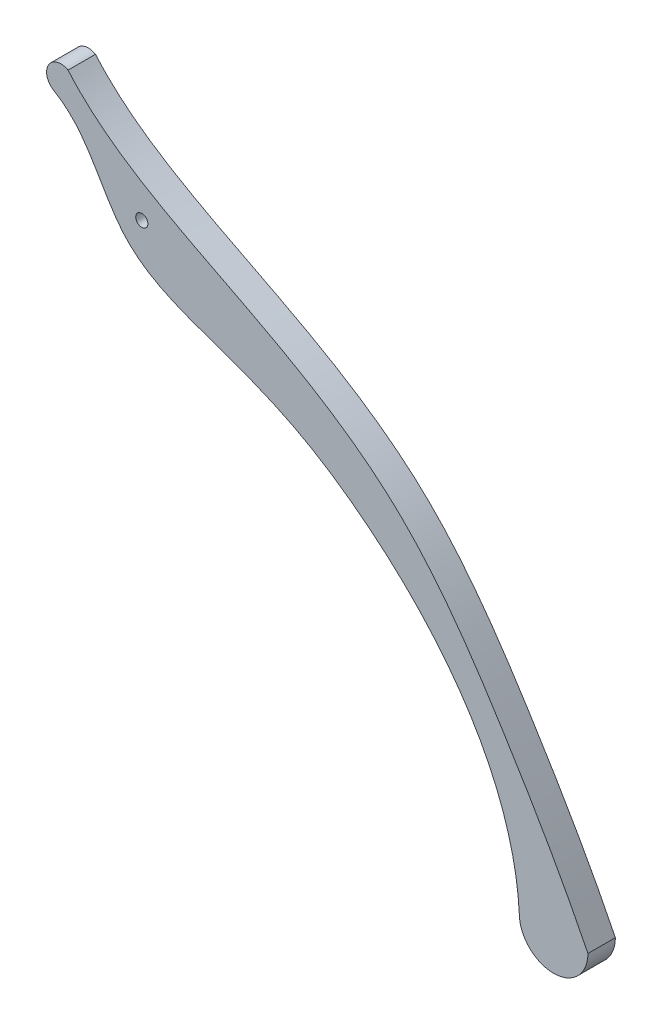
ISO-10303-21;
HEADER;
FILE_DESCRIPTION(('STEP AP214'),'2;1');
FILE_NAME('part.step','',(''),(''),'','','');
FILE_SCHEMA(('AUTOMOTIVE_DESIGN { 1 0 10303 214 1 1 1 1 }'));
ENDSEC;
DATA;
#1=APPLICATION_CONTEXT('core data for automotive mechanical design processes');
#2=APPLICATION_PROTOCOL_DEFINITION('international standard','automotive_design',2000,#1);
#3=PRODUCT_CONTEXT('',#1,'mechanical');
#4=PRODUCT('Part','Part','',(#3));
#5=PRODUCT_RELATED_PRODUCT_CATEGORY('part','',(#4));
#6=PRODUCT_DEFINITION_FORMATION('','',#4);
#7=PRODUCT_DEFINITION_CONTEXT('part definition',#1,'design');
#8=PRODUCT_DEFINITION('design','',#6,#7);
#9=PRODUCT_DEFINITION_SHAPE('','',#8);
#10=(LENGTH_UNIT() NAMED_UNIT(*) SI_UNIT(.MILLI.,.METRE.));
#11=(NAMED_UNIT(*) PLANE_ANGLE_UNIT() SI_UNIT($,.RADIAN.));
#12=(NAMED_UNIT(*) SI_UNIT($,.STERADIAN.) SOLID_ANGLE_UNIT());
#13=UNCERTAINTY_MEASURE_WITH_UNIT(LENGTH_MEASURE(1.E-05),#10,'distance_accuracy_value','');
#14=(GEOMETRIC_REPRESENTATION_CONTEXT(3) GLOBAL_UNCERTAINTY_ASSIGNED_CONTEXT((#13)) GLOBAL_UNIT_ASSIGNED_CONTEXT((#10,
#11,#12)) REPRESENTATION_CONTEXT('',''));
#15=CARTESIAN_POINT('',(0.,0.,0.));
#16=DIRECTION('',(0.,0.,1.));
#17=DIRECTION('',(1.,0.,0.));
#18=AXIS2_PLACEMENT_3D('',#15,#16,#17);
#19=CARTESIAN_POINT('',(103.749844585702,-46.7797880173356,12.));
#20=DIRECTION('',(0.,0.,-1.));
#21=DIRECTION('',(-1.,0.,0.));
#22=AXIS2_PLACEMENT_3D('',#19,#20,#21);
#23=PLANE('',#22);
#24=CARTESIAN_POINT('',(195.000000000002,-180.,12.));
#25=CARTESIAN_POINT('',(183.811606986597,-157.342321494581,12.));
#26=CARTESIAN_POINT('',(158.250235065065,-113.410127760625,12.));
#27=CARTESIAN_POINT('',(116.000678333989,-50.5499551036178,12.));
#28=CARTESIAN_POINT('',(57.9076464876068,-15.3354422556465,12.));
#29=CARTESIAN_POINT('',(6.81742219202341,8.98562715686081,12.));
#30=CARTESIAN_POINT('',(-21.4870672438359,28.2857555584715,12.));
#31=CARTESIAN_POINT('',(-32.2303390593276,40.7679978329799,12.));
#32=B_SPLINE_CURVE_WITH_KNOTS('',3,(#24,#25,#26,#27,#28,#29,#30,#31),.UNSPECIFIED.,.F.,.F.,(4,1,
1,1,1,4),(0.,0.232080309990944,0.474775462913226,0.686323669648783,0.849135819021429,1.),.UNSPECIFIED.);
#33=CARTESIAN_POINT('',(195.000000000002,-180.,12.));
#34=VERTEX_POINT('',#33);
#35=CARTESIAN_POINT('',(-32.2303390593276,40.7679978329799,12.));
#36=VERTEX_POINT('',#35);
#37=EDGE_CURVE('E92',#34,#36,#32,.T.);
#38=ORIENTED_EDGE('',*,*,#37,.T.);
#39=CARTESIAN_POINT('',(-35.3553390593276,35.3553390593272,12.));
#40=DIRECTION('',(0.,0.,1.));
#41=DIRECTION('',(1.,0.,0.));
#42=AXIS2_PLACEMENT_3D('',#39,#40,#41);
#43=CIRCLE('',#42,6.25);
#44=CARTESIAN_POINT('',(-38.4803390593276,29.9426802856744,12.));
#45=VERTEX_POINT('',#44);
#46=EDGE_CURVE('E87',#36,#45,#43,.T.);
#47=ORIENTED_EDGE('',*,*,#46,.T.);
#48=CARTESIAN_POINT('',(-38.4803390593276,29.9426802856744,12.));
#49=CARTESIAN_POINT('',(-22.680791600564,20.9370981787638,12.));
#50=CARTESIAN_POINT('',(-13.7884141041697,-16.124755263341,12.));
#51=CARTESIAN_POINT('',(31.9147437360242,-30.151499794935,12.));
#52=CARTESIAN_POINT('',(67.2533980560327,-43.969392633581,12.));
#53=CARTESIAN_POINT('',(125.0616388722,-82.2156870589665,12.));
#54=CARTESIAN_POINT('',(162.607495356262,-132.950915283272,12.));
#55=CARTESIAN_POINT('',(165.000000000002,-180.,12.));
#56=B_SPLINE_CURVE_WITH_KNOTS('',3,(#48,#49,#50,#51,#52,#53,#54,#55),.UNSPECIFIED.,.F.,.F.,(4,1,
1,1,1,4),(0.,0.170787223157725,0.322785997695807,0.434260945483005,0.547848928197921,1.),.UNSPECIFIED.);
#57=CARTESIAN_POINT('',(165.000000000002,-180.,12.));
#58=VERTEX_POINT('',#57);
#59=EDGE_CURVE('E90',#45,#58,#56,.T.);
#60=ORIENTED_EDGE('',*,*,#59,.T.);
#61=CARTESIAN_POINT('',(180.000000000002,-180.,12.));
#62=DIRECTION('',(0.,0.,1.));
#63=DIRECTION('',(1.,0.,0.));
#64=AXIS2_PLACEMENT_3D('',#61,#62,#63);
#65=CIRCLE('',#64,15.);
#66=EDGE_CURVE('E57',#58,#34,#65,.T.);
#67=ORIENTED_EDGE('',*,*,#66,.T.);
#68=EDGE_LOOP('',(#38,#47,#60,#67));
#69=FACE_BOUND('',#68,.T.);
#70=CARTESIAN_POINT('',(0.,0.,12.));
#71=DIRECTION('',(0.,0.,1.));
#72=DIRECTION('',(1.,0.,0.));
#73=AXIS2_PLACEMENT_3D('',#70,#71,#72);
#74=CIRCLE('',#73,2.65);
#75=CARTESIAN_POINT('',(2.65,0.,12.));
#76=VERTEX_POINT('',#75);
#77=EDGE_CURVE('E136',#76,#76,#74,.T.);
#78=ORIENTED_EDGE('',*,*,#77,.F.);
#79=EDGE_LOOP('',(#78));
#80=FACE_BOUND('',#79,.T.);
#81=ADVANCED_FACE('F39',(#69,#80),#23,.F.);
#82=CARTESIAN_POINT('',(103.749844585702,-46.7797880173356,0.));
#83=DIRECTION('',(0.,0.,-1.));
#84=DIRECTION('',(-1.,0.,0.));
#85=AXIS2_PLACEMENT_3D('',#82,#83,#84);
#86=PLANE('',#85);
#87=CARTESIAN_POINT('',(195.000000000002,-180.,0.));
#88=CARTESIAN_POINT('',(183.811606986597,-157.342321494581,0.));
#89=CARTESIAN_POINT('',(158.250235065065,-113.410127760625,0.));
#90=CARTESIAN_POINT('',(116.000678333989,-50.5499551036178,0.));
#91=CARTESIAN_POINT('',(57.9076464876068,-15.3354422556465,0.));
#92=CARTESIAN_POINT('',(6.81742219202341,8.98562715686081,0.));
#93=CARTESIAN_POINT('',(-21.4870672438359,28.2857555584715,0.));
#94=CARTESIAN_POINT('',(-32.2303390593276,40.7679978329799,0.));
#95=B_SPLINE_CURVE_WITH_KNOTS('',3,(#87,#88,#89,#90,#91,#92,#93,#94),.UNSPECIFIED.,.F.,.F.,(4,1,
1,1,1,4),(0.,0.232080309990944,0.474775462913226,0.686323669648783,0.849135819021429,1.),.UNSPECIFIED.);
#96=CARTESIAN_POINT('',(195.000000000002,-180.,0.));
#97=VERTEX_POINT('',#96);
#98=CARTESIAN_POINT('',(-32.2303390593276,40.7679978329799,0.));
#99=VERTEX_POINT('',#98);
#100=EDGE_CURVE('E142',#97,#99,#95,.T.);
#101=ORIENTED_EDGE('',*,*,#100,.F.);
#102=CARTESIAN_POINT('',(180.000000000002,-180.,0.));
#103=DIRECTION('',(0.,0.,1.));
#104=DIRECTION('',(1.,0.,0.));
#105=AXIS2_PLACEMENT_3D('',#102,#103,#104);
#106=CIRCLE('',#105,15.);
#107=CARTESIAN_POINT('',(165.000000000002,-180.,0.));
#108=VERTEX_POINT('',#107);
#109=EDGE_CURVE('E80',#108,#97,#106,.T.);
#110=ORIENTED_EDGE('',*,*,#109,.F.);
#111=CARTESIAN_POINT('',(-38.4803390593276,29.9426802856744,0.));
#112=CARTESIAN_POINT('',(-22.680791600564,20.9370981787638,0.));
#113=CARTESIAN_POINT('',(-13.7884141041697,-16.124755263341,0.));
#114=CARTESIAN_POINT('',(31.9147437360242,-30.151499794935,0.));
#115=CARTESIAN_POINT('',(67.2533980560327,-43.969392633581,0.));
#116=CARTESIAN_POINT('',(125.0616388722,-82.2156870589665,0.));
#117=CARTESIAN_POINT('',(162.607495356262,-132.950915283272,0.));
#118=CARTESIAN_POINT('',(165.000000000002,-180.,0.));
#119=B_SPLINE_CURVE_WITH_KNOTS('',3,(#111,#112,#113,#114,#115,#116,#117,#118),.UNSPECIFIED.,.F.,
.F.,(4,1,1,1,1,4),(0.,0.170787223157725,0.322785997695807,0.434260945483005,0.547848928197921,
1.),.UNSPECIFIED.);
#120=CARTESIAN_POINT('',(-38.4803390593276,29.9426802856744,0.));
#121=VERTEX_POINT('',#120);
#122=EDGE_CURVE('E74',#121,#108,#119,.T.);
#123=ORIENTED_EDGE('',*,*,#122,.F.);
#124=CARTESIAN_POINT('',(-35.3553390593276,35.3553390593272,0.));
#125=DIRECTION('',(0.,0.,1.));
#126=DIRECTION('',(1.,0.,0.));
#127=AXIS2_PLACEMENT_3D('',#124,#125,#126);
#128=CIRCLE('',#127,6.25);
#129=EDGE_CURVE('E96',#99,#121,#128,.T.);
#130=ORIENTED_EDGE('',*,*,#129,.F.);
#131=EDGE_LOOP('',(#101,#110,#123,#130));
#132=FACE_BOUND('',#131,.T.);
#133=CARTESIAN_POINT('',(0.,0.,0.));
#134=DIRECTION('',(0.,0.,1.));
#135=DIRECTION('',(1.,0.,0.));
#136=AXIS2_PLACEMENT_3D('',#133,#134,#135);
#137=CIRCLE('',#136,2.65);
#138=CARTESIAN_POINT('',(2.65,0.,0.));
#139=VERTEX_POINT('',#138);
#140=EDGE_CURVE('E139',#139,#139,#137,.T.);
#141=ORIENTED_EDGE('',*,*,#140,.T.);
#142=EDGE_LOOP('',(#141));
#143=FACE_BOUND('',#142,.T.);
#144=ADVANCED_FACE('F118',(#132,#143),#86,.T.);
#145=DIRECTION('',(0.,0.,-1.));
#146=VECTOR('',#145,1.);
#147=SURFACE_OF_LINEAR_EXTRUSION('',#32,#146);
#148=ORIENTED_EDGE('',*,*,#100,.T.);
#149=DIRECTION('',(0.,0.,-1.));
#150=VECTOR('',#149,1.);
#151=CARTESIAN_POINT('',(-32.2303390593276,40.7679978329799,12.));
#152=LINE('',#151,#150);
#153=EDGE_CURVE('E11',#36,#99,#152,.T.);
#154=ORIENTED_EDGE('',*,*,#153,.F.);
#155=ORIENTED_EDGE('',*,*,#37,.F.);
#156=DIRECTION('',(0.,0.,-1.));
#157=VECTOR('',#156,1.);
#158=CARTESIAN_POINT('',(195.000000000002,-180.,12.));
#159=LINE('',#158,#157);
#160=EDGE_CURVE('E100',#34,#97,#159,.T.);
#161=ORIENTED_EDGE('',*,*,#160,.T.);
#162=EDGE_LOOP('',(#148,#154,#155,#161));
#163=FACE_BOUND('',#162,.T.);
#164=ADVANCED_FACE('F41',(#163),#147,.F.);
#165=CARTESIAN_POINT('',(-35.3553390593276,35.3553390593272,12.));
#166=DIRECTION('',(0.,0.,-1.));
#167=DIRECTION('',(-1.,0.,0.));
#168=AXIS2_PLACEMENT_3D('',#165,#166,#167);
#169=CYLINDRICAL_SURFACE('',#168,6.25);
#170=ORIENTED_EDGE('',*,*,#129,.T.);
#171=DIRECTION('',(0.,0.,-1.));
#172=VECTOR('',#171,1.);
#173=CARTESIAN_POINT('',(-38.4803390593276,29.9426802856744,12.));
#174=LINE('',#173,#172);
#175=EDGE_CURVE('E49',#45,#121,#174,.T.);
#176=ORIENTED_EDGE('',*,*,#175,.F.);
#177=ORIENTED_EDGE('',*,*,#46,.F.);
#178=ORIENTED_EDGE('',*,*,#153,.T.);
#179=EDGE_LOOP('',(#170,#176,#177,#178));
#180=FACE_BOUND('',#179,.T.);
#181=ADVANCED_FACE('F95',(#180),#169,.T.);
#182=DIRECTION('',(0.,0.,-1.));
#183=VECTOR('',#182,1.);
#184=SURFACE_OF_LINEAR_EXTRUSION('',#56,#183);
#185=ORIENTED_EDGE('',*,*,#122,.T.);
#186=DIRECTION('',(0.,0.,-1.));
#187=VECTOR('',#186,1.);
#188=CARTESIAN_POINT('',(165.000000000002,-180.,12.));
#189=LINE('',#188,#187);
#190=EDGE_CURVE('E97',#58,#108,#189,.T.);
#191=ORIENTED_EDGE('',*,*,#190,.F.);
#192=ORIENTED_EDGE('',*,*,#59,.F.);
#193=ORIENTED_EDGE('',*,*,#175,.T.);
#194=EDGE_LOOP('',(#185,#191,#192,#193));
#195=FACE_BOUND('',#194,.T.);
#196=ADVANCED_FACE('F98',(#195),#184,.F.);
#197=CARTESIAN_POINT('',(180.000000000002,-180.,12.));
#198=DIRECTION('',(0.,0.,-1.));
#199=DIRECTION('',(-1.,0.,0.));
#200=AXIS2_PLACEMENT_3D('',#197,#198,#199);
#201=CYLINDRICAL_SURFACE('',#200,15.);
#202=ORIENTED_EDGE('',*,*,#109,.T.);
#203=ORIENTED_EDGE('',*,*,#160,.F.);
#204=ORIENTED_EDGE('',*,*,#66,.F.);
#205=ORIENTED_EDGE('',*,*,#190,.T.);
#206=EDGE_LOOP('',(#202,#203,#204,#205));
#207=FACE_BOUND('',#206,.T.);
#208=ADVANCED_FACE('F112',(#207),#201,.T.);
#209=CARTESIAN_POINT('',(0.,0.,12.));
#210=DIRECTION('',(0.,0.,-1.));
#211=DIRECTION('',(-1.,0.,0.));
#212=AXIS2_PLACEMENT_3D('',#209,#210,#211);
#213=CYLINDRICAL_SURFACE('',#212,2.65);
#214=ORIENTED_EDGE('',*,*,#77,.T.);
#215=EDGE_LOOP('',(#214));
#216=FACE_BOUND('',#215,.T.);
#217=ORIENTED_EDGE('',*,*,#140,.F.);
#218=EDGE_LOOP('',(#217));
#219=FACE_BOUND('',#218,.T.);
#220=ADVANCED_FACE('F127',(#216,#219),#213,.F.);
#221=CLOSED_SHELL('',(#81,#144,#164,#181,#196,#208,#220));
#222=MANIFOLD_SOLID_BREP('B2',#221);
#223=ADVANCED_BREP_SHAPE_REPRESENTATION('',(#18,#222),#14);
#224=SHAPE_DEFINITION_REPRESENTATION(#9,#223);
ENDSEC;
END-ISO-10303-21;
